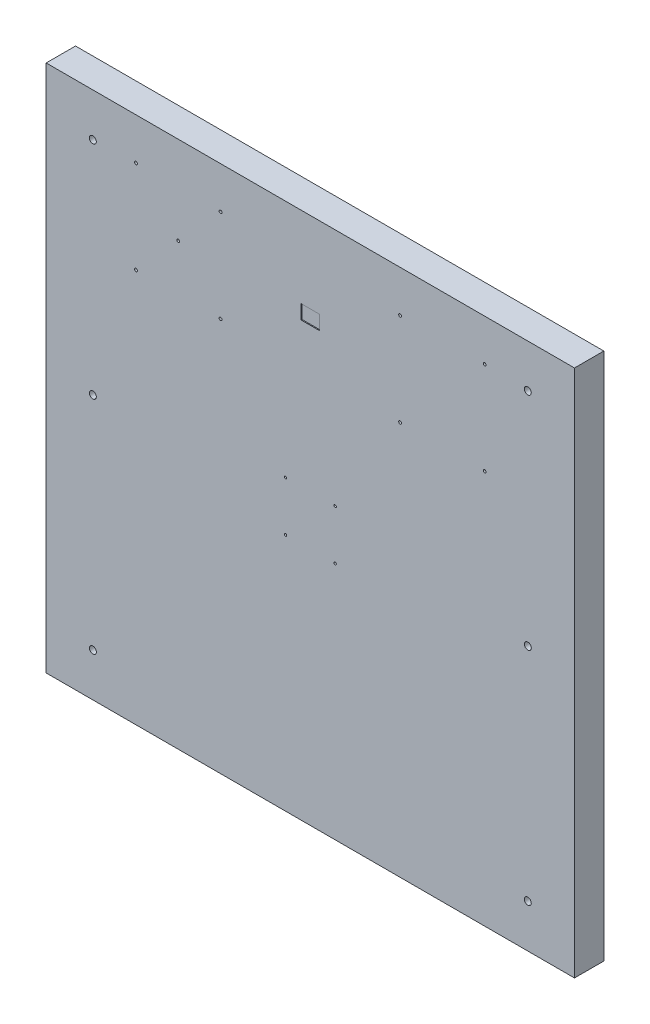
ISO-10303-21;
HEADER;
FILE_DESCRIPTION(('STEP AP214'),'2;1');
FILE_NAME('part.step','',(''),(''),'','','');
FILE_SCHEMA(('AUTOMOTIVE_DESIGN { 1 0 10303 214 1 1 1 1 }'));
ENDSEC;
DATA;
#1=APPLICATION_CONTEXT('core data for automotive mechanical design processes');
#2=APPLICATION_PROTOCOL_DEFINITION('international standard','automotive_design',2000,#1);
#3=PRODUCT_CONTEXT('',#1,'mechanical');
#4=PRODUCT('Part','Part','',(#3));
#5=PRODUCT_RELATED_PRODUCT_CATEGORY('part','',(#4));
#6=PRODUCT_DEFINITION_FORMATION('','',#4);
#7=PRODUCT_DEFINITION_CONTEXT('part definition',#1,'design');
#8=PRODUCT_DEFINITION('design','',#6,#7);
#9=PRODUCT_DEFINITION_SHAPE('','',#8);
#10=(LENGTH_UNIT() NAMED_UNIT(*) SI_UNIT(.MILLI.,.METRE.));
#11=(NAMED_UNIT(*) PLANE_ANGLE_UNIT() SI_UNIT($,.RADIAN.));
#12=(NAMED_UNIT(*) SI_UNIT($,.STERADIAN.) SOLID_ANGLE_UNIT());
#13=UNCERTAINTY_MEASURE_WITH_UNIT(LENGTH_MEASURE(1.E-05),#10,'distance_accuracy_value','');
#14=(GEOMETRIC_REPRESENTATION_CONTEXT(3) GLOBAL_UNCERTAINTY_ASSIGNED_CONTEXT((#13)) GLOBAL_UNIT_ASSIGNED_CONTEXT((#10,
#11,#12)) REPRESENTATION_CONTEXT('',''));
#15=CARTESIAN_POINT('',(0.,0.,0.));
#16=DIRECTION('',(0.,0.,1.));
#17=DIRECTION('',(1.,0.,0.));
#18=AXIS2_PLACEMENT_3D('',#15,#16,#17);
#19=CARTESIAN_POINT('',(0.,0.,25.4));
#20=DIRECTION('',(0.,0.,1.));
#21=DIRECTION('',(1.,0.,0.));
#22=AXIS2_PLACEMENT_3D('',#19,#20,#21);
#23=PLANE('',#22);
#24=DIRECTION('',(1.,0.,0.));
#25=VECTOR('',#24,1.);
#26=CARTESIAN_POINT('',(0.,146.24,25.4));
#27=LINE('',#26,#25);
#28=CARTESIAN_POINT('',(-8.05999999999999,146.24,25.4));
#29=VERTEX_POINT('',#28);
#30=CARTESIAN_POINT('',(8.06000000000001,146.24,25.4));
#31=VERTEX_POINT('',#30);
#32=EDGE_CURVE('E58',#29,#31,#27,.T.);
#33=ORIENTED_EDGE('',*,*,#32,.F.);
#34=DIRECTION('',(0.,-1.,0.));
#35=VECTOR('',#34,1.);
#36=CARTESIAN_POINT('',(-8.05999999999995,0.,25.4));
#37=LINE('',#36,#35);
#38=CARTESIAN_POINT('',(-8.05999999999999,158.56,25.4));
#39=VERTEX_POINT('',#38);
#40=EDGE_CURVE('E176',#39,#29,#37,.T.);
#41=ORIENTED_EDGE('',*,*,#40,.F.);
#42=DIRECTION('',(1.,0.,0.));
#43=VECTOR('',#42,1.);
#44=CARTESIAN_POINT('',(0.,158.56,25.4));
#45=LINE('',#44,#43);
#46=CARTESIAN_POINT('',(8.06000000000001,158.56,25.4));
#47=VERTEX_POINT('',#46);
#48=EDGE_CURVE('E179',#39,#47,#45,.T.);
#49=ORIENTED_EDGE('',*,*,#48,.T.);
#50=DIRECTION('',(0.,-1.,0.));
#51=VECTOR('',#50,1.);
#52=CARTESIAN_POINT('',(8.06000000000001,0.,25.4));
#53=LINE('',#52,#51);
#54=EDGE_CURVE('E185',#47,#31,#53,.T.);
#55=ORIENTED_EDGE('',*,*,#54,.T.);
#56=EDGE_LOOP('',(#33,#41,#49,#55));
#57=FACE_BOUND('',#56,.T.);
#58=CARTESIAN_POINT('',(-77.7,112.3,25.4));
#59=DIRECTION('',(0.,0.,1.));
#60=DIRECTION('',(1.,0.,0.));
#61=AXIS2_PLACEMENT_3D('',#58,#59,#60);
#62=CIRCLE('',#61,1.25);
#63=CARTESIAN_POINT('',(-76.45,112.3,25.4));
#64=VERTEX_POINT('',#63);
#65=EDGE_CURVE('E191',#64,#64,#62,.T.);
#66=ORIENTED_EDGE('',*,*,#65,.F.);
#67=EDGE_LOOP('',(#66));
#68=FACE_BOUND('',#67,.T.);
#69=CARTESIAN_POINT('',(-150.9,192.5,25.4));
#70=DIRECTION('',(0.,0.,1.));
#71=DIRECTION('',(1.,0.,0.));
#72=AXIS2_PLACEMENT_3D('',#69,#70,#71);
#73=CIRCLE('',#72,1.25);
#74=CARTESIAN_POINT('',(-149.65,192.5,25.4));
#75=VERTEX_POINT('',#74);
#76=EDGE_CURVE('E200',#75,#75,#73,.T.);
#77=ORIENTED_EDGE('',*,*,#76,.F.);
#78=EDGE_LOOP('',(#77));
#79=FACE_BOUND('',#78,.T.);
#80=CARTESIAN_POINT('',(-150.9,112.3,25.4));
#81=DIRECTION('',(0.,0.,1.));
#82=DIRECTION('',(1.,0.,0.));
#83=AXIS2_PLACEMENT_3D('',#80,#81,#82);
#84=CIRCLE('',#83,1.25);
#85=CARTESIAN_POINT('',(-149.65,112.3,25.4));
#86=VERTEX_POINT('',#85);
#87=EDGE_CURVE('E206',#86,#86,#84,.T.);
#88=ORIENTED_EDGE('',*,*,#87,.F.);
#89=EDGE_LOOP('',(#88));
#90=FACE_BOUND('',#89,.T.);
#91=CARTESIAN_POINT('',(-77.7,192.5,25.4));
#92=DIRECTION('',(0.,0.,1.));
#93=DIRECTION('',(1.,0.,0.));
#94=AXIS2_PLACEMENT_3D('',#91,#92,#93);
#95=CIRCLE('',#94,1.25);
#96=CARTESIAN_POINT('',(-76.45,192.5,25.4));
#97=VERTEX_POINT('',#96);
#98=EDGE_CURVE('E212',#97,#97,#95,.T.);
#99=ORIENTED_EDGE('',*,*,#98,.F.);
#100=EDGE_LOOP('',(#99));
#101=FACE_BOUND('',#100,.T.);
#102=CARTESIAN_POINT('',(150.9,112.3,25.4));
#103=DIRECTION('',(0.,0.,1.));
#104=DIRECTION('',(1.,0.,0.));
#105=AXIS2_PLACEMENT_3D('',#102,#103,#104);
#106=CIRCLE('',#105,1.25);
#107=CARTESIAN_POINT('',(152.15,112.3,25.4));
#108=VERTEX_POINT('',#107);
#109=EDGE_CURVE('E218',#108,#108,#106,.T.);
#110=ORIENTED_EDGE('',*,*,#109,.F.);
#111=EDGE_LOOP('',(#110));
#112=FACE_BOUND('',#111,.T.);
#113=CARTESIAN_POINT('',(77.6999999999999,192.5,25.4));
#114=DIRECTION('',(0.,0.,1.));
#115=DIRECTION('',(1.,0.,0.));
#116=AXIS2_PLACEMENT_3D('',#113,#114,#115);
#117=CIRCLE('',#116,1.25);
#118=CARTESIAN_POINT('',(78.9499999999999,192.5,25.4));
#119=VERTEX_POINT('',#118);
#120=EDGE_CURVE('E224',#119,#119,#117,.T.);
#121=ORIENTED_EDGE('',*,*,#120,.F.);
#122=EDGE_LOOP('',(#121));
#123=FACE_BOUND('',#122,.T.);
#124=CARTESIAN_POINT('',(150.9,192.5,25.4));
#125=DIRECTION('',(0.,0.,1.));
#126=DIRECTION('',(1.,0.,0.));
#127=AXIS2_PLACEMENT_3D('',#124,#125,#126);
#128=CIRCLE('',#127,1.25);
#129=CARTESIAN_POINT('',(152.15,192.5,25.4));
#130=VERTEX_POINT('',#129);
#131=EDGE_CURVE('E230',#130,#130,#128,.T.);
#132=ORIENTED_EDGE('',*,*,#131,.F.);
#133=EDGE_LOOP('',(#132));
#134=FACE_BOUND('',#133,.T.);
#135=CARTESIAN_POINT('',(77.6999999999999,112.3,25.4));
#136=DIRECTION('',(0.,0.,1.));
#137=DIRECTION('',(1.,0.,0.));
#138=AXIS2_PLACEMENT_3D('',#135,#136,#137);
#139=CIRCLE('',#138,1.25);
#140=CARTESIAN_POINT('',(78.9499999999999,112.3,25.4));
#141=VERTEX_POINT('',#140);
#142=EDGE_CURVE('E236',#141,#141,#139,.T.);
#143=ORIENTED_EDGE('',*,*,#142,.F.);
#144=EDGE_LOOP('',(#143));
#145=FACE_BOUND('',#144,.T.);
#146=CARTESIAN_POINT('',(-114.3,152.4,25.4));
#147=DIRECTION('',(0.,0.,1.));
#148=DIRECTION('',(1.,0.,0.));
#149=AXIS2_PLACEMENT_3D('',#146,#147,#148);
#150=CIRCLE('',#149,1.25);
#151=CARTESIAN_POINT('',(-113.05,152.4,25.4));
#152=VERTEX_POINT('',#151);
#153=EDGE_CURVE('E242',#152,#152,#150,.T.);
#154=ORIENTED_EDGE('',*,*,#153,.F.);
#155=EDGE_LOOP('',(#154));
#156=FACE_BOUND('',#155,.T.);
#157=CARTESIAN_POINT('',(21.5,-21.5,25.4));
#158=DIRECTION('',(0.,0.,1.));
#159=DIRECTION('',(1.,0.,0.));
#160=AXIS2_PLACEMENT_3D('',#157,#158,#159);
#161=CIRCLE('',#160,1.02499999999999);
#162=CARTESIAN_POINT('',(22.525,-21.5,25.4));
#163=VERTEX_POINT('',#162);
#164=EDGE_CURVE('E248',#163,#163,#161,.T.);
#165=ORIENTED_EDGE('',*,*,#164,.F.);
#166=EDGE_LOOP('',(#165));
#167=FACE_BOUND('',#166,.T.);
#168=CARTESIAN_POINT('',(-21.5,21.5,25.4));
#169=DIRECTION('',(0.,0.,1.));
#170=DIRECTION('',(1.,0.,0.));
#171=AXIS2_PLACEMENT_3D('',#168,#169,#170);
#172=CIRCLE('',#171,1.02499999999999);
#173=CARTESIAN_POINT('',(-20.475,21.5,25.4));
#174=VERTEX_POINT('',#173);
#175=EDGE_CURVE('E254',#174,#174,#172,.T.);
#176=ORIENTED_EDGE('',*,*,#175,.F.);
#177=EDGE_LOOP('',(#176));
#178=FACE_BOUND('',#177,.T.);
#179=CARTESIAN_POINT('',(-21.5,-21.5,25.4));
#180=DIRECTION('',(0.,0.,1.));
#181=DIRECTION('',(1.,0.,0.));
#182=AXIS2_PLACEMENT_3D('',#179,#180,#181);
#183=CIRCLE('',#182,1.02499999999999);
#184=CARTESIAN_POINT('',(-20.475,-21.5,25.4));
#185=VERTEX_POINT('',#184);
#186=EDGE_CURVE('E260',#185,#185,#183,.T.);
#187=ORIENTED_EDGE('',*,*,#186,.F.);
#188=EDGE_LOOP('',(#187));
#189=FACE_BOUND('',#188,.T.);
#190=CARTESIAN_POINT('',(21.5,21.5,25.4));
#191=DIRECTION('',(0.,0.,1.));
#192=DIRECTION('',(1.,0.,0.));
#193=AXIS2_PLACEMENT_3D('',#190,#191,#192);
#194=CIRCLE('',#193,1.02499999999999);
#195=CARTESIAN_POINT('',(22.525,21.5,25.4));
#196=VERTEX_POINT('',#195);
#197=EDGE_CURVE('E266',#196,#196,#194,.T.);
#198=ORIENTED_EDGE('',*,*,#197,.F.);
#199=EDGE_LOOP('',(#198));
#200=FACE_BOUND('',#199,.T.);
#201=CARTESIAN_POINT('',(188.2,-191.2,25.4));
#202=DIRECTION('',(0.,0.,1.));
#203=DIRECTION('',(1.,0.,0.));
#204=AXIS2_PLACEMENT_3D('',#201,#202,#203);
#205=CIRCLE('',#204,2.99999999999999);
#206=CARTESIAN_POINT('',(191.2,-191.2,25.4));
#207=VERTEX_POINT('',#206);
#208=EDGE_CURVE('E279',#207,#207,#205,.T.);
#209=ORIENTED_EDGE('',*,*,#208,.F.);
#210=EDGE_LOOP('',(#209));
#211=FACE_BOUND('',#210,.T.);
#212=CARTESIAN_POINT('',(188.2,191.2,25.4));
#213=DIRECTION('',(0.,0.,1.));
#214=DIRECTION('',(-1.,0.,0.));
#215=AXIS2_PLACEMENT_3D('',#212,#213,#214);
#216=CIRCLE('',#215,2.99999999999999);
#217=CARTESIAN_POINT('',(185.2,191.2,25.4));
#218=VERTEX_POINT('',#217);
#219=EDGE_CURVE('E291',#218,#218,#216,.T.);
#220=ORIENTED_EDGE('',*,*,#219,.F.);
#221=EDGE_LOOP('',(#220));
#222=FACE_BOUND('',#221,.T.);
#223=CARTESIAN_POINT('',(-188.2,191.2,25.4));
#224=DIRECTION('',(0.,0.,1.));
#225=DIRECTION('',(1.,0.,0.));
#226=AXIS2_PLACEMENT_3D('',#223,#224,#225);
#227=CIRCLE('',#226,2.99999999999999);
#228=CARTESIAN_POINT('',(-185.2,191.2,25.4));
#229=VERTEX_POINT('',#228);
#230=EDGE_CURVE('E303',#229,#229,#227,.T.);
#231=ORIENTED_EDGE('',*,*,#230,.F.);
#232=EDGE_LOOP('',(#231));
#233=FACE_BOUND('',#232,.T.);
#234=DIRECTION('',(0.,1.,0.));
#235=VECTOR('',#234,1.);
#236=CARTESIAN_POINT('',(228.6,228.6,25.4));
#237=LINE('',#236,#235);
#238=CARTESIAN_POINT('',(228.6,-228.6,25.4));
#239=VERTEX_POINT('',#238);
#240=CARTESIAN_POINT('',(228.6,228.6,25.4));
#241=VERTEX_POINT('',#240);
#242=EDGE_CURVE('E309',#239,#241,#237,.T.);
#243=ORIENTED_EDGE('',*,*,#242,.T.);
#244=DIRECTION('',(-1.,0.,0.));
#245=VECTOR('',#244,1.);
#246=CARTESIAN_POINT('',(-228.6,228.6,25.4));
#247=LINE('',#246,#245);
#248=CARTESIAN_POINT('',(-228.6,228.6,25.4));
#249=VERTEX_POINT('',#248);
#250=EDGE_CURVE('E95',#241,#249,#247,.T.);
#251=ORIENTED_EDGE('',*,*,#250,.T.);
#252=DIRECTION('',(0.,-1.,0.));
#253=VECTOR('',#252,1.);
#254=CARTESIAN_POINT('',(-228.6,228.6,25.4));
#255=LINE('',#254,#253);
#256=CARTESIAN_POINT('',(-228.6,-228.6,25.4));
#257=VERTEX_POINT('',#256);
#258=EDGE_CURVE('E312',#249,#257,#255,.T.);
#259=ORIENTED_EDGE('',*,*,#258,.T.);
#260=DIRECTION('',(1.,0.,0.));
#261=VECTOR('',#260,1.);
#262=CARTESIAN_POINT('',(-228.6,-228.6,25.4));
#263=LINE('',#262,#261);
#264=EDGE_CURVE('E67',#257,#239,#263,.T.);
#265=ORIENTED_EDGE('',*,*,#264,.T.);
#266=EDGE_LOOP('',(#243,#251,#259,#265));
#267=FACE_BOUND('',#266,.T.);
#268=CARTESIAN_POINT('',(-188.2,0.,25.4));
#269=DIRECTION('',(0.,0.,1.));
#270=DIRECTION('',(1.,0.,0.));
#271=AXIS2_PLACEMENT_3D('',#268,#269,#270);
#272=CIRCLE('',#271,2.99999999999999);
#273=CARTESIAN_POINT('',(-185.2,0.,25.4));
#274=VERTEX_POINT('',#273);
#275=EDGE_CURVE('E297',#274,#274,#272,.T.);
#276=ORIENTED_EDGE('',*,*,#275,.F.);
#277=EDGE_LOOP('',(#276));
#278=FACE_BOUND('',#277,.T.);
#279=CARTESIAN_POINT('',(188.2,0.,25.4));
#280=DIRECTION('',(0.,0.,1.));
#281=DIRECTION('',(-1.,0.,0.));
#282=AXIS2_PLACEMENT_3D('',#279,#280,#281);
#283=CIRCLE('',#282,2.99999999999999);
#284=CARTESIAN_POINT('',(185.2,0.,25.4));
#285=VERTEX_POINT('',#284);
#286=EDGE_CURVE('E285',#285,#285,#283,.T.);
#287=ORIENTED_EDGE('',*,*,#286,.F.);
#288=EDGE_LOOP('',(#287));
#289=FACE_BOUND('',#288,.T.);
#290=CARTESIAN_POINT('',(-188.2,-191.2,25.4));
#291=DIRECTION('',(0.,0.,1.));
#292=DIRECTION('',(-1.,0.,0.));
#293=AXIS2_PLACEMENT_3D('',#290,#291,#292);
#294=CIRCLE('',#293,2.99999999999999);
#295=CARTESIAN_POINT('',(-191.2,-191.2,25.4));
#296=VERTEX_POINT('',#295);
#297=EDGE_CURVE('E273',#296,#296,#294,.T.);
#298=ORIENTED_EDGE('',*,*,#297,.F.);
#299=EDGE_LOOP('',(#298));
#300=FACE_BOUND('',#299,.T.);
#301=ADVANCED_FACE('F43',(#57,#68,#79,#90,#101,#112,#123,#134,#145,#156,#167,#178,#189,#200,
#211,#222,#233,#267,#278,#289,#300),#23,.T.);
#302=CARTESIAN_POINT('',(0.,0.,0.));
#303=DIRECTION('',(0.,0.,1.));
#304=DIRECTION('',(1.,0.,0.));
#305=AXIS2_PLACEMENT_3D('',#302,#303,#304);
#306=PLANE('',#305);
#307=DIRECTION('',(0.,1.,0.));
#308=VECTOR('',#307,1.);
#309=CARTESIAN_POINT('',(228.6,228.6,0.));
#310=LINE('',#309,#308);
#311=CARTESIAN_POINT('',(228.6,-228.6,0.));
#312=VERTEX_POINT('',#311);
#313=CARTESIAN_POINT('',(228.6,228.6,0.));
#314=VERTEX_POINT('',#313);
#315=EDGE_CURVE('E306',#312,#314,#310,.T.);
#316=ORIENTED_EDGE('',*,*,#315,.F.);
#317=DIRECTION('',(1.,0.,0.));
#318=VECTOR('',#317,1.);
#319=CARTESIAN_POINT('',(-228.6,-228.6,0.));
#320=LINE('',#319,#318);
#321=CARTESIAN_POINT('',(-228.6,-228.6,0.));
#322=VERTEX_POINT('',#321);
#323=EDGE_CURVE('E88',#322,#312,#320,.T.);
#324=ORIENTED_EDGE('',*,*,#323,.F.);
#325=DIRECTION('',(0.,-1.,0.));
#326=VECTOR('',#325,1.);
#327=CARTESIAN_POINT('',(-228.6,228.6,0.));
#328=LINE('',#327,#326);
#329=CARTESIAN_POINT('',(-228.6,228.6,0.));
#330=VERTEX_POINT('',#329);
#331=EDGE_CURVE('E320',#330,#322,#328,.T.);
#332=ORIENTED_EDGE('',*,*,#331,.F.);
#333=DIRECTION('',(-1.,0.,0.));
#334=VECTOR('',#333,1.);
#335=CARTESIAN_POINT('',(-228.6,228.6,0.));
#336=LINE('',#335,#334);
#337=EDGE_CURVE('E318',#314,#330,#336,.T.);
#338=ORIENTED_EDGE('',*,*,#337,.F.);
#339=EDGE_LOOP('',(#316,#324,#332,#338));
#340=FACE_BOUND('',#339,.T.);
#341=CARTESIAN_POINT('',(-188.2,191.2,0.));
#342=DIRECTION('',(0.,0.,1.));
#343=DIRECTION('',(1.,0.,0.));
#344=AXIS2_PLACEMENT_3D('',#341,#342,#343);
#345=CIRCLE('',#344,2.99999999999999);
#346=CARTESIAN_POINT('',(-185.2,191.2,0.));
#347=VERTEX_POINT('',#346);
#348=EDGE_CURVE('E300',#347,#347,#345,.T.);
#349=ORIENTED_EDGE('',*,*,#348,.T.);
#350=EDGE_LOOP('',(#349));
#351=FACE_BOUND('',#350,.T.);
#352=CARTESIAN_POINT('',(-188.2,0.,0.));
#353=DIRECTION('',(0.,0.,1.));
#354=DIRECTION('',(1.,0.,0.));
#355=AXIS2_PLACEMENT_3D('',#352,#353,#354);
#356=CIRCLE('',#355,2.99999999999999);
#357=CARTESIAN_POINT('',(-185.2,0.,0.));
#358=VERTEX_POINT('',#357);
#359=EDGE_CURVE('E294',#358,#358,#356,.T.);
#360=ORIENTED_EDGE('',*,*,#359,.T.);
#361=EDGE_LOOP('',(#360));
#362=FACE_BOUND('',#361,.T.);
#363=CARTESIAN_POINT('',(188.2,191.2,0.));
#364=DIRECTION('',(0.,0.,1.));
#365=DIRECTION('',(-1.,0.,0.));
#366=AXIS2_PLACEMENT_3D('',#363,#364,#365);
#367=CIRCLE('',#366,2.99999999999999);
#368=CARTESIAN_POINT('',(185.2,191.2,0.));
#369=VERTEX_POINT('',#368);
#370=EDGE_CURVE('E288',#369,#369,#367,.T.);
#371=ORIENTED_EDGE('',*,*,#370,.T.);
#372=EDGE_LOOP('',(#371));
#373=FACE_BOUND('',#372,.T.);
#374=CARTESIAN_POINT('',(188.2,0.,0.));
#375=DIRECTION('',(0.,0.,1.));
#376=DIRECTION('',(-1.,0.,0.));
#377=AXIS2_PLACEMENT_3D('',#374,#375,#376);
#378=CIRCLE('',#377,2.99999999999999);
#379=CARTESIAN_POINT('',(185.2,0.,0.));
#380=VERTEX_POINT('',#379);
#381=EDGE_CURVE('E282',#380,#380,#378,.T.);
#382=ORIENTED_EDGE('',*,*,#381,.T.);
#383=EDGE_LOOP('',(#382));
#384=FACE_BOUND('',#383,.T.);
#385=CARTESIAN_POINT('',(188.2,-191.2,0.));
#386=DIRECTION('',(0.,0.,1.));
#387=DIRECTION('',(1.,0.,0.));
#388=AXIS2_PLACEMENT_3D('',#385,#386,#387);
#389=CIRCLE('',#388,2.99999999999999);
#390=CARTESIAN_POINT('',(191.2,-191.2,0.));
#391=VERTEX_POINT('',#390);
#392=EDGE_CURVE('E276',#391,#391,#389,.T.);
#393=ORIENTED_EDGE('',*,*,#392,.T.);
#394=EDGE_LOOP('',(#393));
#395=FACE_BOUND('',#394,.T.);
#396=CARTESIAN_POINT('',(-188.2,-191.2,0.));
#397=DIRECTION('',(0.,0.,1.));
#398=DIRECTION('',(-1.,0.,0.));
#399=AXIS2_PLACEMENT_3D('',#396,#397,#398);
#400=CIRCLE('',#399,2.99999999999999);
#401=CARTESIAN_POINT('',(-191.2,-191.2,0.));
#402=VERTEX_POINT('',#401);
#403=EDGE_CURVE('E272',#402,#402,#400,.T.);
#404=ORIENTED_EDGE('',*,*,#403,.T.);
#405=EDGE_LOOP('',(#404));
#406=FACE_BOUND('',#405,.T.);
#407=ADVANCED_FACE('F333',(#340,#351,#362,#373,#384,#395,#406),#306,.F.);
#408=CARTESIAN_POINT('',(228.6,228.6,25.4));
#409=DIRECTION('',(-1.,0.,0.));
#410=DIRECTION('',(0.,0.,1.));
#411=AXIS2_PLACEMENT_3D('',#408,#409,#410);
#412=PLANE('',#411);
#413=ORIENTED_EDGE('',*,*,#315,.T.);
#414=DIRECTION('',(0.,0.,-1.));
#415=VECTOR('',#414,1.);
#416=CARTESIAN_POINT('',(228.6,228.6,25.4));
#417=LINE('',#416,#415);
#418=EDGE_CURVE('E11',#241,#314,#417,.T.);
#419=ORIENTED_EDGE('',*,*,#418,.F.);
#420=ORIENTED_EDGE('',*,*,#242,.F.);
#421=DIRECTION('',(0.,0.,-1.));
#422=VECTOR('',#421,1.);
#423=CARTESIAN_POINT('',(228.6,-228.6,25.4));
#424=LINE('',#423,#422);
#425=EDGE_CURVE('E315',#239,#312,#424,.T.);
#426=ORIENTED_EDGE('',*,*,#425,.T.);
#427=EDGE_LOOP('',(#413,#419,#420,#426));
#428=FACE_BOUND('',#427,.T.);
#429=ADVANCED_FACE('F45',(#428),#412,.F.);
#430=CARTESIAN_POINT('',(-228.6,228.6,25.4));
#431=DIRECTION('',(0.,-1.,0.));
#432=DIRECTION('',(0.,0.,-1.));
#433=AXIS2_PLACEMENT_3D('',#430,#431,#432);
#434=PLANE('',#433);
#435=ORIENTED_EDGE('',*,*,#337,.T.);
#436=DIRECTION('',(0.,0.,-1.));
#437=VECTOR('',#436,1.);
#438=CARTESIAN_POINT('',(-228.6,228.6,25.4));
#439=LINE('',#438,#437);
#440=EDGE_CURVE('E51',#249,#330,#439,.T.);
#441=ORIENTED_EDGE('',*,*,#440,.F.);
#442=ORIENTED_EDGE('',*,*,#250,.F.);
#443=ORIENTED_EDGE('',*,*,#418,.T.);
#444=EDGE_LOOP('',(#435,#441,#442,#443));
#445=FACE_BOUND('',#444,.T.);
#446=ADVANCED_FACE('F349',(#445),#434,.F.);
#447=CARTESIAN_POINT('',(-228.6,228.6,25.4));
#448=DIRECTION('',(1.,0.,0.));
#449=DIRECTION('',(0.,1.,0.));
#450=AXIS2_PLACEMENT_3D('',#447,#448,#449);
#451=PLANE('',#450);
#452=ORIENTED_EDGE('',*,*,#331,.T.);
#453=DIRECTION('',(0.,0.,-1.));
#454=VECTOR('',#453,1.);
#455=CARTESIAN_POINT('',(-228.6,-228.6,25.4));
#456=LINE('',#455,#454);
#457=EDGE_CURVE('E324',#257,#322,#456,.T.);
#458=ORIENTED_EDGE('',*,*,#457,.F.);
#459=ORIENTED_EDGE('',*,*,#258,.F.);
#460=ORIENTED_EDGE('',*,*,#440,.T.);
#461=EDGE_LOOP('',(#452,#458,#459,#460));
#462=FACE_BOUND('',#461,.T.);
#463=ADVANCED_FACE('F329',(#462),#451,.F.);
#464=CARTESIAN_POINT('',(-228.6,-228.6,25.4));
#465=DIRECTION('',(0.,1.,0.));
#466=DIRECTION('',(0.,0.,1.));
#467=AXIS2_PLACEMENT_3D('',#464,#465,#466);
#468=PLANE('',#467);
#469=ORIENTED_EDGE('',*,*,#323,.T.);
#470=ORIENTED_EDGE('',*,*,#425,.F.);
#471=ORIENTED_EDGE('',*,*,#264,.F.);
#472=ORIENTED_EDGE('',*,*,#457,.T.);
#473=EDGE_LOOP('',(#469,#470,#471,#472));
#474=FACE_BOUND('',#473,.T.);
#475=ADVANCED_FACE('F338',(#474),#468,.F.);
#476=CARTESIAN_POINT('',(-188.2,191.2,25.4));
#477=DIRECTION('',(0.,0.,-1.));
#478=DIRECTION('',(-1.,0.,0.));
#479=AXIS2_PLACEMENT_3D('',#476,#477,#478);
#480=CYLINDRICAL_SURFACE('',#479,2.99999999999999);
#481=ORIENTED_EDGE('',*,*,#230,.T.);
#482=EDGE_LOOP('',(#481));
#483=FACE_BOUND('',#482,.T.);
#484=ORIENTED_EDGE('',*,*,#348,.F.);
#485=EDGE_LOOP('',(#484));
#486=FACE_BOUND('',#485,.T.);
#487=ADVANCED_FACE('F340',(#483,#486),#480,.F.);
#488=CARTESIAN_POINT('',(-188.2,0.,25.4));
#489=DIRECTION('',(0.,0.,-1.));
#490=DIRECTION('',(-1.,0.,0.));
#491=AXIS2_PLACEMENT_3D('',#488,#489,#490);
#492=CYLINDRICAL_SURFACE('',#491,2.99999999999999);
#493=ORIENTED_EDGE('',*,*,#275,.T.);
#494=EDGE_LOOP('',(#493));
#495=FACE_BOUND('',#494,.T.);
#496=ORIENTED_EDGE('',*,*,#359,.F.);
#497=EDGE_LOOP('',(#496));
#498=FACE_BOUND('',#497,.T.);
#499=ADVANCED_FACE('F346',(#495,#498),#492,.F.);
#500=CARTESIAN_POINT('',(188.2,191.2,25.4));
#501=DIRECTION('',(0.,0.,-1.));
#502=DIRECTION('',(-1.,0.,0.));
#503=AXIS2_PLACEMENT_3D('',#500,#501,#502);
#504=CYLINDRICAL_SURFACE('',#503,2.99999999999999);
#505=ORIENTED_EDGE('',*,*,#219,.T.);
#506=EDGE_LOOP('',(#505));
#507=FACE_BOUND('',#506,.T.);
#508=ORIENTED_EDGE('',*,*,#370,.F.);
#509=EDGE_LOOP('',(#508));
#510=FACE_BOUND('',#509,.T.);
#511=ADVANCED_FACE('F364',(#507,#510),#504,.F.);
#512=CARTESIAN_POINT('',(188.2,0.,25.4));
#513=DIRECTION('',(0.,0.,-1.));
#514=DIRECTION('',(-1.,0.,0.));
#515=AXIS2_PLACEMENT_3D('',#512,#513,#514);
#516=CYLINDRICAL_SURFACE('',#515,2.99999999999999);
#517=ORIENTED_EDGE('',*,*,#286,.T.);
#518=EDGE_LOOP('',(#517));
#519=FACE_BOUND('',#518,.T.);
#520=ORIENTED_EDGE('',*,*,#381,.F.);
#521=EDGE_LOOP('',(#520));
#522=FACE_BOUND('',#521,.T.);
#523=ADVANCED_FACE('F368',(#519,#522),#516,.F.);
#524=CARTESIAN_POINT('',(188.2,-191.2,25.4));
#525=DIRECTION('',(0.,0.,-1.));
#526=DIRECTION('',(-1.,0.,0.));
#527=AXIS2_PLACEMENT_3D('',#524,#525,#526);
#528=CYLINDRICAL_SURFACE('',#527,2.99999999999999);
#529=ORIENTED_EDGE('',*,*,#208,.T.);
#530=EDGE_LOOP('',(#529));
#531=FACE_BOUND('',#530,.T.);
#532=ORIENTED_EDGE('',*,*,#392,.F.);
#533=EDGE_LOOP('',(#532));
#534=FACE_BOUND('',#533,.T.);
#535=ADVANCED_FACE('F372',(#531,#534),#528,.F.);
#536=CARTESIAN_POINT('',(-188.2,-191.2,25.4));
#537=DIRECTION('',(0.,0.,-1.));
#538=DIRECTION('',(-1.,0.,0.));
#539=AXIS2_PLACEMENT_3D('',#536,#537,#538);
#540=CYLINDRICAL_SURFACE('',#539,2.99999999999999);
#541=ORIENTED_EDGE('',*,*,#297,.T.);
#542=EDGE_LOOP('',(#541));
#543=FACE_BOUND('',#542,.T.);
#544=ORIENTED_EDGE('',*,*,#403,.F.);
#545=EDGE_LOOP('',(#544));
#546=FACE_BOUND('',#545,.T.);
#547=ADVANCED_FACE('F376',(#543,#546),#540,.F.);
#548=CARTESIAN_POINT('',(21.5,21.5,21.4));
#549=DIRECTION('',(0.,0.,1.));
#550=DIRECTION('',(1.,0.,0.));
#551=AXIS2_PLACEMENT_3D('',#548,#549,#550);
#552=CONICAL_SURFACE('',#551,1.025,1.02974425867665);
#553=CARTESIAN_POINT('',(21.5,21.5,20.7841178654967));
#554=VERTEX_POINT('',#553);
#555=VERTEX_LOOP('',#554);
#556=FACE_BOUND('',#555,.T.);
#557=CARTESIAN_POINT('',(21.5,21.5,21.4));
#558=DIRECTION('',(0.,0.,1.));
#559=DIRECTION('',(1.,0.,0.));
#560=AXIS2_PLACEMENT_3D('',#557,#558,#559);
#561=CIRCLE('',#560,1.025);
#562=CARTESIAN_POINT('',(22.525,21.5,21.4));
#563=VERTEX_POINT('',#562);
#564=EDGE_CURVE('E269',#563,#563,#561,.T.);
#565=ORIENTED_EDGE('',*,*,#564,.T.);
#566=EDGE_LOOP('',(#565));
#567=FACE_BOUND('',#566,.T.);
#568=ADVANCED_FACE('F380',(#556,#567),#552,.F.);
#569=CARTESIAN_POINT('',(21.5,21.5,25.4));
#570=DIRECTION('',(0.,0.,1.));
#571=DIRECTION('',(1.,0.,0.));
#572=AXIS2_PLACEMENT_3D('',#569,#570,#571);
#573=CYLINDRICAL_SURFACE('',#572,1.02499999999999);
#574=ORIENTED_EDGE('',*,*,#564,.F.);
#575=EDGE_LOOP('',(#574));
#576=FACE_BOUND('',#575,.T.);
#577=ORIENTED_EDGE('',*,*,#197,.T.);
#578=EDGE_LOOP('',(#577));
#579=FACE_BOUND('',#578,.T.);
#580=ADVANCED_FACE('F384',(#576,#579),#573,.F.);
#581=CARTESIAN_POINT('',(-21.5,-21.5,21.4));
#582=DIRECTION('',(0.,0.,1.));
#583=DIRECTION('',(1.,0.,0.));
#584=AXIS2_PLACEMENT_3D('',#581,#582,#583);
#585=CONICAL_SURFACE('',#584,1.025,1.02974425867665);
#586=CARTESIAN_POINT('',(-21.5,-21.5,20.7841178654967));
#587=VERTEX_POINT('',#586);
#588=VERTEX_LOOP('',#587);
#589=FACE_BOUND('',#588,.T.);
#590=CARTESIAN_POINT('',(-21.5,-21.5,21.4));
#591=DIRECTION('',(0.,0.,1.));
#592=DIRECTION('',(1.,0.,0.));
#593=AXIS2_PLACEMENT_3D('',#590,#591,#592);
#594=CIRCLE('',#593,1.025);
#595=CARTESIAN_POINT('',(-20.475,-21.5,21.4));
#596=VERTEX_POINT('',#595);
#597=EDGE_CURVE('E263',#596,#596,#594,.T.);
#598=ORIENTED_EDGE('',*,*,#597,.T.);
#599=EDGE_LOOP('',(#598));
#600=FACE_BOUND('',#599,.T.);
#601=ADVANCED_FACE('F388',(#589,#600),#585,.F.);
#602=CARTESIAN_POINT('',(-21.5,-21.5,25.4));
#603=DIRECTION('',(0.,0.,1.));
#604=DIRECTION('',(1.,0.,0.));
#605=AXIS2_PLACEMENT_3D('',#602,#603,#604);
#606=CYLINDRICAL_SURFACE('',#605,1.02499999999999);
#607=ORIENTED_EDGE('',*,*,#597,.F.);
#608=EDGE_LOOP('',(#607));
#609=FACE_BOUND('',#608,.T.);
#610=ORIENTED_EDGE('',*,*,#186,.T.);
#611=EDGE_LOOP('',(#610));
#612=FACE_BOUND('',#611,.T.);
#613=ADVANCED_FACE('F392',(#609,#612),#606,.F.);
#614=CARTESIAN_POINT('',(-21.5,21.5,21.4));
#615=DIRECTION('',(0.,0.,1.));
#616=DIRECTION('',(1.,0.,0.));
#617=AXIS2_PLACEMENT_3D('',#614,#615,#616);
#618=CONICAL_SURFACE('',#617,1.025,1.02974425867665);
#619=CARTESIAN_POINT('',(-21.5,21.5,20.7841178654967));
#620=VERTEX_POINT('',#619);
#621=VERTEX_LOOP('',#620);
#622=FACE_BOUND('',#621,.T.);
#623=CARTESIAN_POINT('',(-21.5,21.5,21.4));
#624=DIRECTION('',(0.,0.,1.));
#625=DIRECTION('',(1.,0.,0.));
#626=AXIS2_PLACEMENT_3D('',#623,#624,#625);
#627=CIRCLE('',#626,1.025);
#628=CARTESIAN_POINT('',(-20.475,21.5,21.4));
#629=VERTEX_POINT('',#628);
#630=EDGE_CURVE('E257',#629,#629,#627,.T.);
#631=ORIENTED_EDGE('',*,*,#630,.T.);
#632=EDGE_LOOP('',(#631));
#633=FACE_BOUND('',#632,.T.);
#634=ADVANCED_FACE('F396',(#622,#633),#618,.F.);
#635=CARTESIAN_POINT('',(-21.5,21.5,25.4));
#636=DIRECTION('',(0.,0.,1.));
#637=DIRECTION('',(1.,0.,0.));
#638=AXIS2_PLACEMENT_3D('',#635,#636,#637);
#639=CYLINDRICAL_SURFACE('',#638,1.02499999999999);
#640=ORIENTED_EDGE('',*,*,#630,.F.);
#641=EDGE_LOOP('',(#640));
#642=FACE_BOUND('',#641,.T.);
#643=ORIENTED_EDGE('',*,*,#175,.T.);
#644=EDGE_LOOP('',(#643));
#645=FACE_BOUND('',#644,.T.);
#646=ADVANCED_FACE('F400',(#642,#645),#639,.F.);
#647=CARTESIAN_POINT('',(21.5,-21.5,21.4));
#648=DIRECTION('',(0.,0.,1.));
#649=DIRECTION('',(1.,0.,0.));
#650=AXIS2_PLACEMENT_3D('',#647,#648,#649);
#651=CONICAL_SURFACE('',#650,1.025,1.02974425867665);
#652=CARTESIAN_POINT('',(21.5,-21.5,20.7841178654967));
#653=VERTEX_POINT('',#652);
#654=VERTEX_LOOP('',#653);
#655=FACE_BOUND('',#654,.T.);
#656=CARTESIAN_POINT('',(21.5,-21.5,21.4));
#657=DIRECTION('',(0.,0.,1.));
#658=DIRECTION('',(1.,0.,0.));
#659=AXIS2_PLACEMENT_3D('',#656,#657,#658);
#660=CIRCLE('',#659,1.025);
#661=CARTESIAN_POINT('',(22.525,-21.5,21.4));
#662=VERTEX_POINT('',#661);
#663=EDGE_CURVE('E251',#662,#662,#660,.T.);
#664=ORIENTED_EDGE('',*,*,#663,.T.);
#665=EDGE_LOOP('',(#664));
#666=FACE_BOUND('',#665,.T.);
#667=ADVANCED_FACE('F404',(#655,#666),#651,.F.);
#668=CARTESIAN_POINT('',(21.5,-21.5,25.4));
#669=DIRECTION('',(0.,0.,1.));
#670=DIRECTION('',(1.,0.,0.));
#671=AXIS2_PLACEMENT_3D('',#668,#669,#670);
#672=CYLINDRICAL_SURFACE('',#671,1.02499999999999);
#673=ORIENTED_EDGE('',*,*,#663,.F.);
#674=EDGE_LOOP('',(#673));
#675=FACE_BOUND('',#674,.T.);
#676=ORIENTED_EDGE('',*,*,#164,.T.);
#677=EDGE_LOOP('',(#676));
#678=FACE_BOUND('',#677,.T.);
#679=ADVANCED_FACE('F408',(#675,#678),#672,.F.);
#680=CARTESIAN_POINT('',(-114.3,152.4,19.4));
#681=DIRECTION('',(0.,0.,1.));
#682=DIRECTION('',(1.,0.,0.));
#683=AXIS2_PLACEMENT_3D('',#680,#681,#682);
#684=CONICAL_SURFACE('',#683,1.25,1.02974425867666);
#685=CARTESIAN_POINT('',(-114.3,152.4,18.6489242262156));
#686=VERTEX_POINT('',#685);
#687=VERTEX_LOOP('',#686);
#688=FACE_BOUND('',#687,.T.);
#689=CARTESIAN_POINT('',(-114.3,152.4,19.4));
#690=DIRECTION('',(0.,0.,1.));
#691=DIRECTION('',(1.,0.,0.));
#692=AXIS2_PLACEMENT_3D('',#689,#690,#691);
#693=CIRCLE('',#692,1.25);
#694=CARTESIAN_POINT('',(-113.05,152.4,19.4));
#695=VERTEX_POINT('',#694);
#696=EDGE_CURVE('E245',#695,#695,#693,.T.);
#697=ORIENTED_EDGE('',*,*,#696,.T.);
#698=EDGE_LOOP('',(#697));
#699=FACE_BOUND('',#698,.T.);
#700=ADVANCED_FACE('F412',(#688,#699),#684,.F.);
#701=CARTESIAN_POINT('',(-114.3,152.4,25.4));
#702=DIRECTION('',(0.,0.,1.));
#703=DIRECTION('',(1.,0.,0.));
#704=AXIS2_PLACEMENT_3D('',#701,#702,#703);
#705=CYLINDRICAL_SURFACE('',#704,1.25);
#706=ORIENTED_EDGE('',*,*,#696,.F.);
#707=EDGE_LOOP('',(#706));
#708=FACE_BOUND('',#707,.T.);
#709=ORIENTED_EDGE('',*,*,#153,.T.);
#710=EDGE_LOOP('',(#709));
#711=FACE_BOUND('',#710,.T.);
#712=ADVANCED_FACE('F416',(#708,#711),#705,.F.);
#713=CARTESIAN_POINT('',(77.6999999999999,112.3,19.4));
#714=DIRECTION('',(0.,0.,1.));
#715=DIRECTION('',(1.,0.,0.));
#716=AXIS2_PLACEMENT_3D('',#713,#714,#715);
#717=CONICAL_SURFACE('',#716,1.25,1.02974425867666);
#718=CARTESIAN_POINT('',(77.6999999999999,112.3,18.6489242262156));
#719=VERTEX_POINT('',#718);
#720=VERTEX_LOOP('',#719);
#721=FACE_BOUND('',#720,.T.);
#722=CARTESIAN_POINT('',(77.6999999999999,112.3,19.4));
#723=DIRECTION('',(0.,0.,1.));
#724=DIRECTION('',(1.,0.,0.));
#725=AXIS2_PLACEMENT_3D('',#722,#723,#724);
#726=CIRCLE('',#725,1.25);
#727=CARTESIAN_POINT('',(78.9499999999999,112.3,19.4));
#728=VERTEX_POINT('',#727);
#729=EDGE_CURVE('E239',#728,#728,#726,.T.);
#730=ORIENTED_EDGE('',*,*,#729,.T.);
#731=EDGE_LOOP('',(#730));
#732=FACE_BOUND('',#731,.T.);
#733=ADVANCED_FACE('F420',(#721,#732),#717,.F.);
#734=CARTESIAN_POINT('',(77.6999999999999,112.3,25.4));
#735=DIRECTION('',(0.,0.,1.));
#736=DIRECTION('',(1.,0.,0.));
#737=AXIS2_PLACEMENT_3D('',#734,#735,#736);
#738=CYLINDRICAL_SURFACE('',#737,1.25);
#739=ORIENTED_EDGE('',*,*,#729,.F.);
#740=EDGE_LOOP('',(#739));
#741=FACE_BOUND('',#740,.T.);
#742=ORIENTED_EDGE('',*,*,#142,.T.);
#743=EDGE_LOOP('',(#742));
#744=FACE_BOUND('',#743,.T.);
#745=ADVANCED_FACE('F424',(#741,#744),#738,.F.);
#746=CARTESIAN_POINT('',(150.9,192.5,19.4));
#747=DIRECTION('',(0.,0.,1.));
#748=DIRECTION('',(1.,0.,0.));
#749=AXIS2_PLACEMENT_3D('',#746,#747,#748);
#750=CONICAL_SURFACE('',#749,1.25,1.02974425867666);
#751=CARTESIAN_POINT('',(150.9,192.5,18.6489242262156));
#752=VERTEX_POINT('',#751);
#753=VERTEX_LOOP('',#752);
#754=FACE_BOUND('',#753,.T.);
#755=CARTESIAN_POINT('',(150.9,192.5,19.4));
#756=DIRECTION('',(0.,0.,1.));
#757=DIRECTION('',(1.,0.,0.));
#758=AXIS2_PLACEMENT_3D('',#755,#756,#757);
#759=CIRCLE('',#758,1.25);
#760=CARTESIAN_POINT('',(152.15,192.5,19.4));
#761=VERTEX_POINT('',#760);
#762=EDGE_CURVE('E233',#761,#761,#759,.T.);
#763=ORIENTED_EDGE('',*,*,#762,.T.);
#764=EDGE_LOOP('',(#763));
#765=FACE_BOUND('',#764,.T.);
#766=ADVANCED_FACE('F428',(#754,#765),#750,.F.);
#767=CARTESIAN_POINT('',(150.9,192.5,25.4));
#768=DIRECTION('',(0.,0.,1.));
#769=DIRECTION('',(1.,0.,0.));
#770=AXIS2_PLACEMENT_3D('',#767,#768,#769);
#771=CYLINDRICAL_SURFACE('',#770,1.25);
#772=ORIENTED_EDGE('',*,*,#762,.F.);
#773=EDGE_LOOP('',(#772));
#774=FACE_BOUND('',#773,.T.);
#775=ORIENTED_EDGE('',*,*,#131,.T.);
#776=EDGE_LOOP('',(#775));
#777=FACE_BOUND('',#776,.T.);
#778=ADVANCED_FACE('F432',(#774,#777),#771,.F.);
#779=CARTESIAN_POINT('',(77.6999999999999,192.5,19.4));
#780=DIRECTION('',(0.,0.,1.));
#781=DIRECTION('',(1.,0.,0.));
#782=AXIS2_PLACEMENT_3D('',#779,#780,#781);
#783=CONICAL_SURFACE('',#782,1.25,1.02974425867666);
#784=CARTESIAN_POINT('',(77.6999999999999,192.5,18.6489242262156));
#785=VERTEX_POINT('',#784);
#786=VERTEX_LOOP('',#785);
#787=FACE_BOUND('',#786,.T.);
#788=CARTESIAN_POINT('',(77.6999999999999,192.5,19.4));
#789=DIRECTION('',(0.,0.,1.));
#790=DIRECTION('',(1.,0.,0.));
#791=AXIS2_PLACEMENT_3D('',#788,#789,#790);
#792=CIRCLE('',#791,1.25);
#793=CARTESIAN_POINT('',(78.9499999999999,192.5,19.4));
#794=VERTEX_POINT('',#793);
#795=EDGE_CURVE('E227',#794,#794,#792,.T.);
#796=ORIENTED_EDGE('',*,*,#795,.T.);
#797=EDGE_LOOP('',(#796));
#798=FACE_BOUND('',#797,.T.);
#799=ADVANCED_FACE('F436',(#787,#798),#783,.F.);
#800=CARTESIAN_POINT('',(77.6999999999999,192.5,25.4));
#801=DIRECTION('',(0.,0.,1.));
#802=DIRECTION('',(1.,0.,0.));
#803=AXIS2_PLACEMENT_3D('',#800,#801,#802);
#804=CYLINDRICAL_SURFACE('',#803,1.25);
#805=ORIENTED_EDGE('',*,*,#795,.F.);
#806=EDGE_LOOP('',(#805));
#807=FACE_BOUND('',#806,.T.);
#808=ORIENTED_EDGE('',*,*,#120,.T.);
#809=EDGE_LOOP('',(#808));
#810=FACE_BOUND('',#809,.T.);
#811=ADVANCED_FACE('F440',(#807,#810),#804,.F.);
#812=CARTESIAN_POINT('',(150.9,112.3,19.4));
#813=DIRECTION('',(0.,0.,1.));
#814=DIRECTION('',(1.,0.,0.));
#815=AXIS2_PLACEMENT_3D('',#812,#813,#814);
#816=CONICAL_SURFACE('',#815,1.25,1.02974425867666);
#817=CARTESIAN_POINT('',(150.9,112.3,18.6489242262156));
#818=VERTEX_POINT('',#817);
#819=VERTEX_LOOP('',#818);
#820=FACE_BOUND('',#819,.T.);
#821=CARTESIAN_POINT('',(150.9,112.3,19.4));
#822=DIRECTION('',(0.,0.,1.));
#823=DIRECTION('',(1.,0.,0.));
#824=AXIS2_PLACEMENT_3D('',#821,#822,#823);
#825=CIRCLE('',#824,1.25);
#826=CARTESIAN_POINT('',(152.15,112.3,19.4));
#827=VERTEX_POINT('',#826);
#828=EDGE_CURVE('E221',#827,#827,#825,.T.);
#829=ORIENTED_EDGE('',*,*,#828,.T.);
#830=EDGE_LOOP('',(#829));
#831=FACE_BOUND('',#830,.T.);
#832=ADVANCED_FACE('F444',(#820,#831),#816,.F.);
#833=CARTESIAN_POINT('',(150.9,112.3,25.4));
#834=DIRECTION('',(0.,0.,1.));
#835=DIRECTION('',(1.,0.,0.));
#836=AXIS2_PLACEMENT_3D('',#833,#834,#835);
#837=CYLINDRICAL_SURFACE('',#836,1.25);
#838=ORIENTED_EDGE('',*,*,#828,.F.);
#839=EDGE_LOOP('',(#838));
#840=FACE_BOUND('',#839,.T.);
#841=ORIENTED_EDGE('',*,*,#109,.T.);
#842=EDGE_LOOP('',(#841));
#843=FACE_BOUND('',#842,.T.);
#844=ADVANCED_FACE('F448',(#840,#843),#837,.F.);
#845=CARTESIAN_POINT('',(-77.7,192.5,19.4));
#846=DIRECTION('',(0.,0.,1.));
#847=DIRECTION('',(1.,0.,0.));
#848=AXIS2_PLACEMENT_3D('',#845,#846,#847);
#849=CONICAL_SURFACE('',#848,1.25,1.02974425867666);
#850=CARTESIAN_POINT('',(-77.7,192.5,18.6489242262156));
#851=VERTEX_POINT('',#850);
#852=VERTEX_LOOP('',#851);
#853=FACE_BOUND('',#852,.T.);
#854=CARTESIAN_POINT('',(-77.7,192.5,19.4));
#855=DIRECTION('',(0.,0.,1.));
#856=DIRECTION('',(1.,0.,0.));
#857=AXIS2_PLACEMENT_3D('',#854,#855,#856);
#858=CIRCLE('',#857,1.25);
#859=CARTESIAN_POINT('',(-76.45,192.5,19.4));
#860=VERTEX_POINT('',#859);
#861=EDGE_CURVE('E215',#860,#860,#858,.T.);
#862=ORIENTED_EDGE('',*,*,#861,.T.);
#863=EDGE_LOOP('',(#862));
#864=FACE_BOUND('',#863,.T.);
#865=ADVANCED_FACE('F452',(#853,#864),#849,.F.);
#866=CARTESIAN_POINT('',(-77.7,192.5,25.4));
#867=DIRECTION('',(0.,0.,1.));
#868=DIRECTION('',(1.,0.,0.));
#869=AXIS2_PLACEMENT_3D('',#866,#867,#868);
#870=CYLINDRICAL_SURFACE('',#869,1.25);
#871=ORIENTED_EDGE('',*,*,#861,.F.);
#872=EDGE_LOOP('',(#871));
#873=FACE_BOUND('',#872,.T.);
#874=ORIENTED_EDGE('',*,*,#98,.T.);
#875=EDGE_LOOP('',(#874));
#876=FACE_BOUND('',#875,.T.);
#877=ADVANCED_FACE('F456',(#873,#876),#870,.F.);
#878=CARTESIAN_POINT('',(-150.9,112.3,19.4));
#879=DIRECTION('',(0.,0.,1.));
#880=DIRECTION('',(1.,0.,0.));
#881=AXIS2_PLACEMENT_3D('',#878,#879,#880);
#882=CONICAL_SURFACE('',#881,1.25,1.02974425867666);
#883=CARTESIAN_POINT('',(-150.9,112.3,18.6489242262156));
#884=VERTEX_POINT('',#883);
#885=VERTEX_LOOP('',#884);
#886=FACE_BOUND('',#885,.T.);
#887=CARTESIAN_POINT('',(-150.9,112.3,19.4));
#888=DIRECTION('',(0.,0.,1.));
#889=DIRECTION('',(1.,0.,0.));
#890=AXIS2_PLACEMENT_3D('',#887,#888,#889);
#891=CIRCLE('',#890,1.25);
#892=CARTESIAN_POINT('',(-149.65,112.3,19.4));
#893=VERTEX_POINT('',#892);
#894=EDGE_CURVE('E209',#893,#893,#891,.T.);
#895=ORIENTED_EDGE('',*,*,#894,.T.);
#896=EDGE_LOOP('',(#895));
#897=FACE_BOUND('',#896,.T.);
#898=ADVANCED_FACE('F460',(#886,#897),#882,.F.);
#899=CARTESIAN_POINT('',(-150.9,112.3,25.4));
#900=DIRECTION('',(0.,0.,1.));
#901=DIRECTION('',(1.,0.,0.));
#902=AXIS2_PLACEMENT_3D('',#899,#900,#901);
#903=CYLINDRICAL_SURFACE('',#902,1.25);
#904=ORIENTED_EDGE('',*,*,#894,.F.);
#905=EDGE_LOOP('',(#904));
#906=FACE_BOUND('',#905,.T.);
#907=ORIENTED_EDGE('',*,*,#87,.T.);
#908=EDGE_LOOP('',(#907));
#909=FACE_BOUND('',#908,.T.);
#910=ADVANCED_FACE('F464',(#906,#909),#903,.F.);
#911=CARTESIAN_POINT('',(-150.9,192.5,19.4));
#912=DIRECTION('',(0.,0.,1.));
#913=DIRECTION('',(1.,0.,0.));
#914=AXIS2_PLACEMENT_3D('',#911,#912,#913);
#915=CONICAL_SURFACE('',#914,1.25,1.02974425867666);
#916=CARTESIAN_POINT('',(-150.9,192.5,18.6489242262156));
#917=VERTEX_POINT('',#916);
#918=VERTEX_LOOP('',#917);
#919=FACE_BOUND('',#918,.T.);
#920=CARTESIAN_POINT('',(-150.9,192.5,19.4));
#921=DIRECTION('',(0.,0.,1.));
#922=DIRECTION('',(1.,0.,0.));
#923=AXIS2_PLACEMENT_3D('',#920,#921,#922);
#924=CIRCLE('',#923,1.25);
#925=CARTESIAN_POINT('',(-149.65,192.5,19.4));
#926=VERTEX_POINT('',#925);
#927=EDGE_CURVE('E203',#926,#926,#924,.T.);
#928=ORIENTED_EDGE('',*,*,#927,.T.);
#929=EDGE_LOOP('',(#928));
#930=FACE_BOUND('',#929,.T.);
#931=ADVANCED_FACE('F468',(#919,#930),#915,.F.);
#932=CARTESIAN_POINT('',(-150.9,192.5,25.4));
#933=DIRECTION('',(0.,0.,1.));
#934=DIRECTION('',(1.,0.,0.));
#935=AXIS2_PLACEMENT_3D('',#932,#933,#934);
#936=CYLINDRICAL_SURFACE('',#935,1.25);
#937=ORIENTED_EDGE('',*,*,#927,.F.);
#938=EDGE_LOOP('',(#937));
#939=FACE_BOUND('',#938,.T.);
#940=ORIENTED_EDGE('',*,*,#76,.T.);
#941=EDGE_LOOP('',(#940));
#942=FACE_BOUND('',#941,.T.);
#943=ADVANCED_FACE('F472',(#939,#942),#936,.F.);
#944=CARTESIAN_POINT('',(-77.7,112.3,19.4));
#945=DIRECTION('',(0.,0.,1.));
#946=DIRECTION('',(1.,0.,0.));
#947=AXIS2_PLACEMENT_3D('',#944,#945,#946);
#948=CONICAL_SURFACE('',#947,1.25,1.02974425867666);
#949=CARTESIAN_POINT('',(-77.7,112.3,18.6489242262156));
#950=VERTEX_POINT('',#949);
#951=VERTEX_LOOP('',#950);
#952=FACE_BOUND('',#951,.T.);
#953=CARTESIAN_POINT('',(-77.7,112.3,19.4));
#954=DIRECTION('',(0.,0.,1.));
#955=DIRECTION('',(1.,0.,0.));
#956=AXIS2_PLACEMENT_3D('',#953,#954,#955);
#957=CIRCLE('',#956,1.25);
#958=CARTESIAN_POINT('',(-76.45,112.3,19.4));
#959=VERTEX_POINT('',#958);
#960=EDGE_CURVE('E197',#959,#959,#957,.T.);
#961=ORIENTED_EDGE('',*,*,#960,.T.);
#962=EDGE_LOOP('',(#961));
#963=FACE_BOUND('',#962,.T.);
#964=ADVANCED_FACE('F476',(#952,#963),#948,.F.);
#965=CARTESIAN_POINT('',(-77.7,112.3,25.4));
#966=DIRECTION('',(0.,0.,1.));
#967=DIRECTION('',(1.,0.,0.));
#968=AXIS2_PLACEMENT_3D('',#965,#966,#967);
#969=CYLINDRICAL_SURFACE('',#968,1.25);
#970=ORIENTED_EDGE('',*,*,#960,.F.);
#971=EDGE_LOOP('',(#970));
#972=FACE_BOUND('',#971,.T.);
#973=ORIENTED_EDGE('',*,*,#65,.T.);
#974=EDGE_LOOP('',(#973));
#975=FACE_BOUND('',#974,.T.);
#976=ADVANCED_FACE('F480',(#972,#975),#969,.F.);
#977=CARTESIAN_POINT('',(0.,146.24,24.58));
#978=DIRECTION('',(0.,-1.,0.));
#979=DIRECTION('',(0.,0.,-1.));
#980=AXIS2_PLACEMENT_3D('',#977,#978,#979);
#981=PLANE('',#980);
#982=ORIENTED_EDGE('',*,*,#32,.T.);
#983=DIRECTION('',(0.,0.,1.));
#984=VECTOR('',#983,1.);
#985=CARTESIAN_POINT('',(8.06000000000001,146.24,24.58));
#986=LINE('',#985,#984);
#987=CARTESIAN_POINT('',(8.06000000000001,146.24,24.58));
#988=VERTEX_POINT('',#987);
#989=EDGE_CURVE('E160',#988,#31,#986,.T.);
#990=ORIENTED_EDGE('',*,*,#989,.F.);
#991=DIRECTION('',(1.,0.,0.));
#992=VECTOR('',#991,1.);
#993=CARTESIAN_POINT('',(0.,146.24,24.58));
#994=LINE('',#993,#992);
#995=CARTESIAN_POINT('',(-8.05999999999999,146.24,24.58));
#996=VERTEX_POINT('',#995);
#997=EDGE_CURVE('E167',#996,#988,#994,.T.);
#998=ORIENTED_EDGE('',*,*,#997,.F.);
#999=DIRECTION('',(0.,0.,1.));
#1000=VECTOR('',#999,1.);
#1001=CARTESIAN_POINT('',(-8.05999999999999,146.24,24.58));
#1002=LINE('',#1001,#1000);
#1003=EDGE_CURVE('E189',#996,#29,#1002,.T.);
#1004=ORIENTED_EDGE('',*,*,#1003,.T.);
#1005=EDGE_LOOP('',(#982,#990,#998,#1004));
#1006=FACE_BOUND('',#1005,.T.);
#1007=ADVANCED_FACE('F170',(#1006),#981,.F.);
#1008=CARTESIAN_POINT('',(-8.05999999999995,0.,24.58));
#1009=DIRECTION('',(-1.,0.,0.));
#1010=DIRECTION('',(0.,-1.,0.));
#1011=AXIS2_PLACEMENT_3D('',#1008,#1009,#1010);
#1012=PLANE('',#1011);
#1013=ORIENTED_EDGE('',*,*,#40,.T.);
#1014=ORIENTED_EDGE('',*,*,#1003,.F.);
#1015=DIRECTION('',(0.,-1.,0.));
#1016=VECTOR('',#1015,1.);
#1017=CARTESIAN_POINT('',(-8.05999999999995,0.,24.58));
#1018=LINE('',#1017,#1016);
#1019=CARTESIAN_POINT('',(-8.05999999999999,158.56,24.58));
#1020=VERTEX_POINT('',#1019);
#1021=EDGE_CURVE('E172',#1020,#996,#1018,.T.);
#1022=ORIENTED_EDGE('',*,*,#1021,.F.);
#1023=DIRECTION('',(0.,0.,1.));
#1024=VECTOR('',#1023,1.);
#1025=CARTESIAN_POINT('',(-8.05999999999999,158.56,24.58));
#1026=LINE('',#1025,#1024);
#1027=EDGE_CURVE('E192',#1020,#39,#1026,.T.);
#1028=ORIENTED_EDGE('',*,*,#1027,.T.);
#1029=EDGE_LOOP('',(#1013,#1014,#1022,#1028));
#1030=FACE_BOUND('',#1029,.T.);
#1031=ADVANCED_FACE('F486',(#1030),#1012,.F.);
#1032=CARTESIAN_POINT('',(0.,158.56,24.58));
#1033=DIRECTION('',(0.,-1.,0.));
#1034=DIRECTION('',(0.,0.,-1.));
#1035=AXIS2_PLACEMENT_3D('',#1032,#1033,#1034);
#1036=PLANE('',#1035);
#1037=ORIENTED_EDGE('',*,*,#48,.F.);
#1038=ORIENTED_EDGE('',*,*,#1027,.F.);
#1039=DIRECTION('',(1.,0.,0.));
#1040=VECTOR('',#1039,1.);
#1041=CARTESIAN_POINT('',(0.,158.56,24.58));
#1042=LINE('',#1041,#1040);
#1043=CARTESIAN_POINT('',(8.06000000000001,158.56,24.58));
#1044=VERTEX_POINT('',#1043);
#1045=EDGE_CURVE('E166',#1020,#1044,#1042,.T.);
#1046=ORIENTED_EDGE('',*,*,#1045,.T.);
#1047=DIRECTION('',(0.,0.,1.));
#1048=VECTOR('',#1047,1.);
#1049=CARTESIAN_POINT('',(8.06000000000001,158.56,24.58));
#1050=LINE('',#1049,#1048);
#1051=EDGE_CURVE('E162',#1044,#47,#1050,.T.);
#1052=ORIENTED_EDGE('',*,*,#1051,.T.);
#1053=EDGE_LOOP('',(#1037,#1038,#1046,#1052));
#1054=FACE_BOUND('',#1053,.T.);
#1055=ADVANCED_FACE('F489',(#1054),#1036,.T.);
#1056=CARTESIAN_POINT('',(8.06000000000001,0.,24.58));
#1057=DIRECTION('',(-1.,0.,0.));
#1058=DIRECTION('',(0.,0.,1.));
#1059=AXIS2_PLACEMENT_3D('',#1056,#1057,#1058);
#1060=PLANE('',#1059);
#1061=ORIENTED_EDGE('',*,*,#54,.F.);
#1062=ORIENTED_EDGE('',*,*,#1051,.F.);
#1063=DIRECTION('',(0.,-1.,0.));
#1064=VECTOR('',#1063,1.);
#1065=CARTESIAN_POINT('',(8.06000000000001,0.,24.58));
#1066=LINE('',#1065,#1064);
#1067=EDGE_CURVE('E157',#1044,#988,#1066,.T.);
#1068=ORIENTED_EDGE('',*,*,#1067,.T.);
#1069=ORIENTED_EDGE('',*,*,#989,.T.);
#1070=EDGE_LOOP('',(#1061,#1062,#1068,#1069));
#1071=FACE_BOUND('',#1070,.T.);
#1072=ADVANCED_FACE('F159',(#1071),#1060,.T.);
#1073=CARTESIAN_POINT('',(0.,0.,24.58));
#1074=DIRECTION('',(0.,0.,1.));
#1075=DIRECTION('',(1.,0.,0.));
#1076=AXIS2_PLACEMENT_3D('',#1073,#1074,#1075);
#1077=PLANE('',#1076);
#1078=ORIENTED_EDGE('',*,*,#997,.T.);
#1079=ORIENTED_EDGE('',*,*,#1067,.F.);
#1080=ORIENTED_EDGE('',*,*,#1045,.F.);
#1081=ORIENTED_EDGE('',*,*,#1021,.T.);
#1082=EDGE_LOOP('',(#1078,#1079,#1080,#1081));
#1083=FACE_BOUND('',#1082,.T.);
#1084=ADVANCED_FACE('F174',(#1083),#1077,.T.);
#1085=CLOSED_SHELL('',(#301,#407,#429,#446,#463,#475,#487,#499,#511,#523,#535,#547,#568,#580,
#601,#613,#634,#646,#667,#679,#700,#712,#733,#745,#766,#778,#799,#811,#832,#844,#865,#877,#898,
#910,#931,#943,#964,#976,#1007,#1031,#1055,#1072,#1084));
#1086=MANIFOLD_SOLID_BREP('B2',#1085);
#1087=ADVANCED_BREP_SHAPE_REPRESENTATION('',(#18,#1086),#14);
#1088=SHAPE_DEFINITION_REPRESENTATION(#9,#1087);
ENDSEC;
END-ISO-10303-21;
